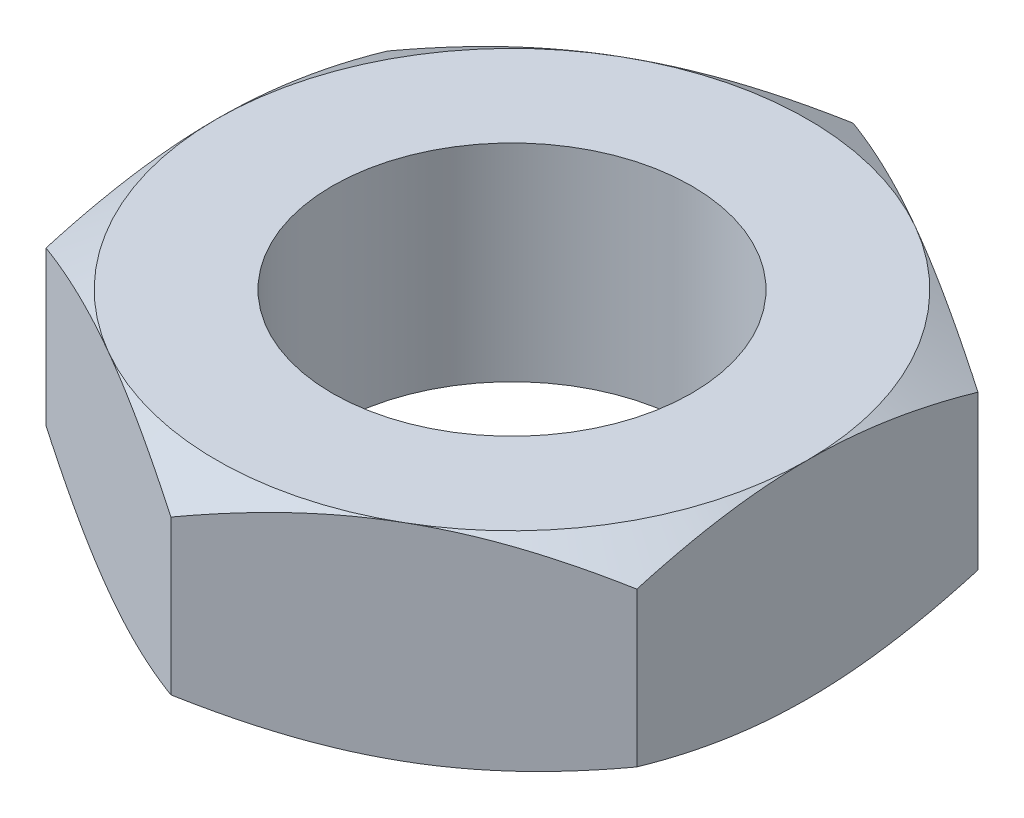
ISO-10303-21;
HEADER;
FILE_DESCRIPTION(('STEP AP214'),'2;1');
FILE_NAME('part.step','',(''),(''),'','','');
FILE_SCHEMA(('AUTOMOTIVE_DESIGN { 1 0 10303 214 1 1 1 1 }'));
ENDSEC;
DATA;
#1=APPLICATION_CONTEXT('core data for automotive mechanical design processes');
#2=APPLICATION_PROTOCOL_DEFINITION('international standard','automotive_design',2000,#1);
#3=PRODUCT_CONTEXT('',#1,'mechanical');
#4=PRODUCT('Part','Part','',(#3));
#5=PRODUCT_RELATED_PRODUCT_CATEGORY('part','',(#4));
#6=PRODUCT_DEFINITION_FORMATION('','',#4);
#7=PRODUCT_DEFINITION_CONTEXT('part definition',#1,'design');
#8=PRODUCT_DEFINITION('design','',#6,#7);
#9=PRODUCT_DEFINITION_SHAPE('','',#8);
#10=(LENGTH_UNIT() NAMED_UNIT(*) SI_UNIT(.MILLI.,.METRE.));
#11=(NAMED_UNIT(*) PLANE_ANGLE_UNIT() SI_UNIT($,.RADIAN.));
#12=(NAMED_UNIT(*) SI_UNIT($,.STERADIAN.) SOLID_ANGLE_UNIT());
#13=UNCERTAINTY_MEASURE_WITH_UNIT(LENGTH_MEASURE(1.E-05),#10,'distance_accuracy_value','');
#14=(GEOMETRIC_REPRESENTATION_CONTEXT(3) GLOBAL_UNCERTAINTY_ASSIGNED_CONTEXT((#13)) GLOBAL_UNIT_ASSIGNED_CONTEXT((#10,
#11,#12)) REPRESENTATION_CONTEXT('',''));
#15=CARTESIAN_POINT('',(0.,0.,0.));
#16=DIRECTION('',(0.,0.,1.));
#17=DIRECTION('',(1.,0.,0.));
#18=AXIS2_PLACEMENT_3D('',#15,#16,#17);
#19=CARTESIAN_POINT('',(-3.96875,1.3890625,-2.29135888084633));
#20=DIRECTION('',(0.,1.,0.));
#21=DIRECTION('',(0.,0.,1.));
#22=AXIS2_PLACEMENT_3D('',#19,#20,#21);
#23=PLANE('',#22);
#24=CARTESIAN_POINT('',(0.,1.3890625,0.));
#25=DIRECTION('',(0.,1.,0.));
#26=DIRECTION('',(0.,0.,1.));
#27=AXIS2_PLACEMENT_3D('',#24,#25,#26);
#28=CIRCLE('',#27,2.413);
#29=CARTESIAN_POINT('',(0.,1.3890625,2.413));
#30=VERTEX_POINT('',#29);
#31=EDGE_CURVE('E239',#30,#30,#28,.T.);
#32=ORIENTED_EDGE('',*,*,#31,.F.);
#33=EDGE_LOOP('',(#32));
#34=FACE_BOUND('',#33,.T.);
#35=CARTESIAN_POINT('',(0.,1.3890625,0.));
#36=DIRECTION('',(0.,1.,0.));
#37=DIRECTION('',(0.,0.,1.));
#38=AXIS2_PLACEMENT_3D('',#35,#36,#37);
#39=CIRCLE('',#38,3.96875);
#40=CARTESIAN_POINT('',(-1.984375,1.3890625,3.43703832126949));
#41=VERTEX_POINT('',#40);
#42=CARTESIAN_POINT('',(1.984375,1.3890625,3.43703832126949));
#43=VERTEX_POINT('',#42);
#44=EDGE_CURVE('E298',#41,#43,#39,.T.);
#45=ORIENTED_EDGE('',*,*,#44,.T.);
#46=CARTESIAN_POINT('',(3.96875,1.3890625,0.));
#47=VERTEX_POINT('',#46);
#48=EDGE_CURVE('E301',#43,#47,#39,.T.);
#49=ORIENTED_EDGE('',*,*,#48,.T.);
#50=CARTESIAN_POINT('',(1.984375,1.3890625,-3.43703832126949));
#51=VERTEX_POINT('',#50);
#52=EDGE_CURVE('E308',#47,#51,#39,.T.);
#53=ORIENTED_EDGE('',*,*,#52,.T.);
#54=CARTESIAN_POINT('',(-1.984375,1.3890625,-3.43703832126949));
#55=VERTEX_POINT('',#54);
#56=EDGE_CURVE('E312',#51,#55,#39,.T.);
#57=ORIENTED_EDGE('',*,*,#56,.T.);
#58=CARTESIAN_POINT('',(-3.96875,1.3890625,0.));
#59=VERTEX_POINT('',#58);
#60=EDGE_CURVE('E305',#55,#59,#39,.T.);
#61=ORIENTED_EDGE('',*,*,#60,.T.);
#62=EDGE_CURVE('E300',#59,#41,#39,.T.);
#63=ORIENTED_EDGE('',*,*,#62,.T.);
#64=EDGE_LOOP('',(#45,#49,#53,#57,#61,#63));
#65=FACE_BOUND('',#64,.T.);
#66=ADVANCED_FACE('F35',(#34,#65),#23,.T.);
#67=CARTESIAN_POINT('',(0.,1.3890625,-4.58271776169265));
#68=DIRECTION('',(0.5,0.,0.866025403784438));
#69=DIRECTION('',(0.866025403784439,0.,-0.5));
#70=AXIS2_PLACEMENT_3D('',#67,#68,#69);
#71=PLANE('',#70);
#72=DIRECTION('',(0.,-1.,0.));
#73=VECTOR('',#72,1.);
#74=CARTESIAN_POINT('',(0.,1.3890625,-4.58271776169265));
#75=LINE('',#74,#73);
#76=CARTESIAN_POINT('',(0.,1.034588047513,-4.58271776169265));
#77=VERTEX_POINT('',#76);
#78=CARTESIAN_POINT('',(0.,-1.034588047513,-4.58271776169265));
#79=VERTEX_POINT('',#78);
#80=EDGE_CURVE('E236',#77,#79,#75,.T.);
#81=ORIENTED_EDGE('',*,*,#80,.T.);
#82=CARTESIAN_POINT('',(0.00019999999999965,-1.03452137832671,-4.58283323174649));
#83=CARTESIAN_POINT('',(-0.174205902081157,-1.09267788164553,-4.48213993723168));
#84=CARTESIAN_POINT('',(-0.350117265982851,-1.14556901401833,-4.38057746392952));
#85=CARTESIAN_POINT('',(-0.704986056512738,-1.23789081645719,-4.17569387219009));
#86=CARTESIAN_POINT('',(-0.883949788458082,-1.27728882681341,-4.07236911337627));
#87=CARTESIAN_POINT('',(-1.23965934318176,-1.3386172964786,-3.86700010620323));
#88=CARTESIAN_POINT('',(-1.41635043707328,-1.36095593380879,-3.76498745558155));
#89=CARTESIAN_POINT('',(-1.7705639777928,-1.38762315750667,-3.56048217249653));
#90=CARTESIAN_POINT('',(-1.94808513722975,-1.39197382713073,-3.45799028330875));
#91=CARTESIAN_POINT('',(-2.27979074080338,-1.38292085025305,-3.26647996379381));
#92=CARTESIAN_POINT('',(-2.43402485076552,-1.37174001600782,-3.17743285888894));
#93=CARTESIAN_POINT('',(-2.74148824092522,-1.33630397944562,-2.99991878781428));
#94=CARTESIAN_POINT('',(-2.89471645773984,-1.31203667319011,-2.91145243558892));
#95=CARTESIAN_POINT('',(-3.20281373181353,-1.25137053864588,-2.73357239146588));
#96=CARTESIAN_POINT('',(-3.3576437962636,-1.21471455942136,-2.64418121207699));
#97=CARTESIAN_POINT('',(-3.66499472649982,-1.13151999862476,-2.46673206976942));
#98=CARTESIAN_POINT('',(-3.81751952962953,-1.08500096376704,-2.37867183362439));
#99=CARTESIAN_POINT('',(-3.96895,-1.03452137832671,-2.29124341079249));
#100=B_SPLINE_CURVE_WITH_KNOTS('',3,(#82,#83,#84,#85,#86,#87,#88,#89,#90,#91,#92,#93,#94,#95,
#96,#97,#98,#99),.UNSPECIFIED.,.F.,.F.,(4,2,2,2,2,2,2,2,4),(0.,0.629094460519773,
1.25970103886327,1.87470051579827,2.48894475282133,3.02377031984306,3.55909140824994,
4.1062865060967,4.65240713705191),.UNSPECIFIED.);
#101=CARTESIAN_POINT('',(-1.984375,-1.3890625,-3.43703832126949));
#102=VERTEX_POINT('',#101);
#103=EDGE_CURVE('E58',#79,#102,#100,.T.);
#104=ORIENTED_EDGE('',*,*,#103,.T.);
#105=CARTESIAN_POINT('',(-3.96875,-1.03458804751317,-2.2913588808466));
#106=VERTEX_POINT('',#105);
#107=EDGE_CURVE('E194',#102,#106,#100,.T.);
#108=ORIENTED_EDGE('',*,*,#107,.T.);
#109=DIRECTION('',(0.,-1.,0.));
#110=VECTOR('',#109,1.);
#111=CARTESIAN_POINT('',(-3.96875,1.3890625,-2.29135888084633));
#112=LINE('',#111,#110);
#113=CARTESIAN_POINT('',(-3.96875,1.03458804751317,-2.2913588808466));
#114=VERTEX_POINT('',#113);
#115=EDGE_CURVE('E224',#114,#106,#112,.T.);
#116=ORIENTED_EDGE('',*,*,#115,.F.);
#117=CARTESIAN_POINT('',(0.00019999999999965,1.03452137832671,-4.58283323174649));
#118=CARTESIAN_POINT('',(-0.174205902081157,1.09267788164553,-4.48213993723168));
#119=CARTESIAN_POINT('',(-0.350117265982851,1.14556901401833,-4.38057746392952));
#120=CARTESIAN_POINT('',(-0.704986056512738,1.23789081645719,-4.17569387219009));
#121=CARTESIAN_POINT('',(-0.883949788458082,1.27728882681341,-4.07236911337627));
#122=CARTESIAN_POINT('',(-1.23965934318176,1.3386172964786,-3.86700010620323));
#123=CARTESIAN_POINT('',(-1.41635043707328,1.36095593380879,-3.76498745558155));
#124=CARTESIAN_POINT('',(-1.7705639777928,1.38762315750667,-3.56048217249653));
#125=CARTESIAN_POINT('',(-1.94808513722975,1.39197382713073,-3.45799028330875));
#126=CARTESIAN_POINT('',(-2.27979074080338,1.38292085025305,-3.26647996379381));
#127=CARTESIAN_POINT('',(-2.43402485076552,1.37174001600782,-3.17743285888894));
#128=CARTESIAN_POINT('',(-2.74148824092522,1.33630397944562,-2.99991878781428));
#129=CARTESIAN_POINT('',(-2.89471645773984,1.31203667319011,-2.91145243558892));
#130=CARTESIAN_POINT('',(-3.20281373181353,1.25137053864588,-2.73357239146588));
#131=CARTESIAN_POINT('',(-3.3576437962636,1.21471455942136,-2.64418121207699));
#132=CARTESIAN_POINT('',(-3.66499472649982,1.13151999862476,-2.46673206976942));
#133=CARTESIAN_POINT('',(-3.81751952962953,1.08500096376704,-2.37867183362439));
#134=CARTESIAN_POINT('',(-3.96895,1.03452137832671,-2.29124341079249));
#135=B_SPLINE_CURVE_WITH_KNOTS('',3,(#117,#118,#119,#120,#121,#122,#123,#124,#125,#126,#127,
#128,#129,#130,#131,#132,#133,#134),.UNSPECIFIED.,.F.,.F.,(4,2,2,2,2,2,2,2,4),(0.,
0.629094460519773,1.25970103886327,1.87470051579827,2.48894475282133,3.02377031984306,
3.55909140824994,4.1062865060967,4.65240713705191),.UNSPECIFIED.);
#136=EDGE_CURVE('E246',#55,#114,#135,.T.);
#137=ORIENTED_EDGE('',*,*,#136,.F.);
#138=EDGE_CURVE('E243',#77,#55,#135,.T.);
#139=ORIENTED_EDGE('',*,*,#138,.F.);
#140=EDGE_LOOP('',(#81,#104,#108,#116,#137,#139));
#141=FACE_BOUND('',#140,.T.);
#142=ADVANCED_FACE('F37',(#141),#71,.F.);
#143=CARTESIAN_POINT('',(-3.96875,1.3890625,-2.29135888084633));
#144=DIRECTION('',(1.,0.,0.));
#145=DIRECTION('',(0.,0.,-1.));
#146=AXIS2_PLACEMENT_3D('',#143,#144,#145);
#147=PLANE('',#146);
#148=ORIENTED_EDGE('',*,*,#115,.T.);
#149=CARTESIAN_POINT('',(-3.96875,0.580270643707875,-6.22169695676345));
#150=CARTESIAN_POINT('',(-3.96875,0.495629554498546,-6.04776097042012));
#151=CARTESIAN_POINT('',(-3.96875,0.411781015228385,-5.87343276197247));
#152=CARTESIAN_POINT('',(-3.96875,0.246113557528974,-5.52378352626055));
#153=CARTESIAN_POINT('',(-3.96875,0.164294946503743,-5.34846235350417));
#154=CARTESIAN_POINT('',(-3.96875,0.00273455510915178,-4.99574743703183));
#155=CARTESIAN_POINT('',(-3.96875,-0.0769940637955183,-4.8183476443733));
#156=CARTESIAN_POINT('',(-3.96875,-0.233275940637596,-4.46216001234746));
#157=CARTESIAN_POINT('',(-3.96875,-0.3098293443539,-4.28337223715292));
#158=CARTESIAN_POINT('',(-3.96875,-0.461404283867797,-3.91814940793921));
#159=CARTESIAN_POINT('',(-3.96875,-0.536290207564717,-3.7316577704564));
#160=CARTESIAN_POINT('',(-3.96875,-0.680554504087907,-3.35651758495646));
#161=CARTESIAN_POINT('',(-3.96875,-0.74993226847017,-3.16786880128179));
#162=CARTESIAN_POINT('',(-3.96875,-0.881408126224332,-2.78844599514931));
#163=CARTESIAN_POINT('',(-3.96875,-0.943520384294776,-2.59767692965097));
#164=CARTESIAN_POINT('',(-3.96875,-1.05851662121305,-2.21340311120669));
#165=CARTESIAN_POINT('',(-3.96875,-1.11140343580595,-2.01989921874075));
#166=CARTESIAN_POINT('',(-3.96875,-1.20517636129246,-1.6311091012753));
#167=CARTESIAN_POINT('',(-3.96875,-1.24612852574059,-1.43583910195992));
#168=CARTESIAN_POINT('',(-3.96875,-1.31375702721554,-1.0428024899618));
#169=CARTESIAN_POINT('',(-3.96875,-1.34043487467902,-0.845036143697719));
#170=CARTESIAN_POINT('',(-3.96875,-1.3770403841221,-0.450605512338849));
#171=CARTESIAN_POINT('',(-3.96875,-1.38718865783126,-0.25396221985486));
#172=CARTESIAN_POINT('',(-3.96875,-1.39045976447106,0.139485992218314));
#173=CARTESIAN_POINT('',(-3.96875,-1.38358228756796,0.33629091468368));
#174=CARTESIAN_POINT('',(-3.96875,-1.35810261812635,0.668410754752708));
#175=CARTESIAN_POINT('',(-3.96875,-1.3437432404343,0.804072537555573));
#176=CARTESIAN_POINT('',(-3.96875,-1.30779247207964,1.0744408102038));
#177=CARTESIAN_POINT('',(-3.96875,-1.28620015652866,1.20914717562759));
#178=CARTESIAN_POINT('',(-3.96875,-1.21170483065242,1.61162887315064));
#179=CARTESIAN_POINT('',(-3.96875,-1.14909538893366,1.87762972847311));
#180=CARTESIAN_POINT('',(-3.96875,-1.04002741153514,2.27555191163833));
#181=CARTESIAN_POINT('',(-3.96875,-1.00061037701119,2.40952100703487));
#182=CARTESIAN_POINT('',(-3.96875,-0.917560151569727,2.67615857994853));
#183=CARTESIAN_POINT('',(-3.96875,-0.873926928994569,2.80882704769153));
#184=CARTESIAN_POINT('',(-3.96875,-0.783154734396829,3.07290448457615));
#185=CARTESIAN_POINT('',(-3.96875,-0.736016795290462,3.20431381202589));
#186=CARTESIAN_POINT('',(-3.96875,-0.638802011642294,3.46603416335526));
#187=CARTESIAN_POINT('',(-3.96875,-0.588725228974448,3.59634521029189));
#188=CARTESIAN_POINT('',(-3.96875,-0.452575047627681,3.94088412858893));
#189=CARTESIAN_POINT('',(-3.96875,-0.364374104411039,4.15427038484706));
#190=CARTESIAN_POINT('',(-3.96875,-0.18294698514972,4.57890352123334));
#191=CARTESIAN_POINT('',(-3.96875,-0.0897202959000224,4.79015018024977));
#192=CARTESIAN_POINT('',(-3.96875,0.100589836396977,5.21097578363183));
#193=CARTESIAN_POINT('',(-3.96875,0.197674518443244,5.42055416586364));
#194=CARTESIAN_POINT('',(-3.96875,0.394806200491001,5.83831597781125));
#195=CARTESIAN_POINT('',(-3.96875,0.494853286808513,6.04649936666374));
#196=CARTESIAN_POINT('',(-3.96875,0.697421654018019,6.46204015936939));
#197=CARTESIAN_POINT('',(-3.96875,0.799946395513732,6.66939587286292));
#198=CARTESIAN_POINT('',(-3.96875,1.00685664462163,7.08317779146199));
#199=CARTESIAN_POINT('',(-3.96875,1.11124217149255,7.2896039869195));
#200=CARTESIAN_POINT('',(-3.96875,1.42658702639339,7.90765670661576));
#201=CARTESIAN_POINT('',(-3.96875,1.63977745980658,8.31814439261519));
#202=CARTESIAN_POINT('',(-3.96875,2.04807122962612,9.09498840679135));
#203=CARTESIAN_POINT('',(-3.96875,2.24278532373391,9.46155029736983));
#204=CARTESIAN_POINT('',(-3.96875,2.63459143839332,10.1934273187956));
#205=CARTESIAN_POINT('',(-3.96875,2.83168359443524,10.5587423770687));
#206=CARTESIAN_POINT('',(-3.96875,3.22699755433617,11.2872403110954));
#207=CARTESIAN_POINT('',(-3.96875,3.42521369250251,11.6504262661362));
#208=CARTESIAN_POINT('',(-3.96875,3.82300419769018,12.3760186060547));
#209=CARTESIAN_POINT('',(-3.96875,4.02257846210827,12.7384250471593));
#210=CARTESIAN_POINT('',(-3.96875,4.22264849263489,13.1005558551109));
#211=B_SPLINE_CURVE_WITH_KNOTS('',3,(#149,#150,#151,#152,#153,#154,#155,#156,#157,#158,#159,
#160,#161,#162,#163,#164,#165,#166,#167,#168,#169,#170,#171,#172,#173,#174,#175,#176,#177,#178,
#179,#180,#181,#182,#183,#184,#185,#186,#187,#188,#189,#190,#191,#192,#193,#194,#195,#196,#197,
#198,#199,#200,#201,#202,#203,#204,#205,#206,#207,#208,#209,#210),.UNSPECIFIED.,.F.,.F.,(4,2,2,
2,2,2,2,2,2,2,2,2,2,2,2,2,2,2,2,2,2,2,2,2,2,2,2,2,2,2,4),(0.,0.580317532576746,1.16072241618541,
1.74417501419442,2.32760079530033,2.93042926439164,3.53332423092783,4.13502349111168,
4.73653747196744,5.33465617674795,5.93271157908309,6.52271762195251,7.11273440180051,
7.52179616412226,7.93091025386496,8.74954934292227,9.16845446095107,9.58736272461321,
10.0061480125919,10.4249244866913,11.1175183219819,11.8101830160883,12.5030719870989,
13.1959811668256,13.8899215612347,14.5838691419566,15.9714733438239,17.2166675132063,
18.4619329658364,19.7031966118937,20.9443675020377),.UNSPECIFIED.);
#212=CARTESIAN_POINT('',(-3.96875,-1.3890625,0.));
#213=VERTEX_POINT('',#212);
#214=EDGE_CURVE('E279',#106,#213,#211,.T.);
#215=ORIENTED_EDGE('',*,*,#214,.T.);
#216=CARTESIAN_POINT('',(-3.96875,-1.034588047513,2.29135888084633));
#217=VERTEX_POINT('',#216);
#218=EDGE_CURVE('E273',#213,#217,#211,.T.);
#219=ORIENTED_EDGE('',*,*,#218,.T.);
#220=DIRECTION('',(0.,-1.,0.));
#221=VECTOR('',#220,1.);
#222=CARTESIAN_POINT('',(-3.96875,1.3890625,2.29135888084633));
#223=LINE('',#222,#221);
#224=CARTESIAN_POINT('',(-3.96875,1.034588047513,2.29135888084633));
#225=VERTEX_POINT('',#224);
#226=EDGE_CURVE('E227',#225,#217,#223,.T.);
#227=ORIENTED_EDGE('',*,*,#226,.F.);
#228=CARTESIAN_POINT('',(-3.96875,-0.580270643707875,-6.22169695676345));
#229=CARTESIAN_POINT('',(-3.96875,-0.495629554498546,-6.04776097042012));
#230=CARTESIAN_POINT('',(-3.96875,-0.411781015228385,-5.87343276197247));
#231=CARTESIAN_POINT('',(-3.96875,-0.246113557528974,-5.52378352626055));
#232=CARTESIAN_POINT('',(-3.96875,-0.164294946503743,-5.34846235350417));
#233=CARTESIAN_POINT('',(-3.96875,-0.00273455510915178,-4.99574743703183));
#234=CARTESIAN_POINT('',(-3.96875,0.0769940637955183,-4.8183476443733));
#235=CARTESIAN_POINT('',(-3.96875,0.233275940637596,-4.46216001234746));
#236=CARTESIAN_POINT('',(-3.96875,0.3098293443539,-4.28337223715292));
#237=CARTESIAN_POINT('',(-3.96875,0.461404283867797,-3.91814940793921));
#238=CARTESIAN_POINT('',(-3.96875,0.536290207564717,-3.7316577704564));
#239=CARTESIAN_POINT('',(-3.96875,0.680554504087907,-3.35651758495646));
#240=CARTESIAN_POINT('',(-3.96875,0.74993226847017,-3.16786880128179));
#241=CARTESIAN_POINT('',(-3.96875,0.881408126224332,-2.78844599514931));
#242=CARTESIAN_POINT('',(-3.96875,0.943520384294776,-2.59767692965097));
#243=CARTESIAN_POINT('',(-3.96875,1.05851662121305,-2.21340311120669));
#244=CARTESIAN_POINT('',(-3.96875,1.11140343580595,-2.01989921874075));
#245=CARTESIAN_POINT('',(-3.96875,1.20517636129246,-1.6311091012753));
#246=CARTESIAN_POINT('',(-3.96875,1.24612852574059,-1.43583910195992));
#247=CARTESIAN_POINT('',(-3.96875,1.31375702721554,-1.0428024899618));
#248=CARTESIAN_POINT('',(-3.96875,1.34043487467902,-0.845036143697719));
#249=CARTESIAN_POINT('',(-3.96875,1.3770403841221,-0.450605512338849));
#250=CARTESIAN_POINT('',(-3.96875,1.38718865783126,-0.25396221985486));
#251=CARTESIAN_POINT('',(-3.96875,1.39045976447106,0.139485992218314));
#252=CARTESIAN_POINT('',(-3.96875,1.38358228756796,0.33629091468368));
#253=CARTESIAN_POINT('',(-3.96875,1.35810261812635,0.668410754752708));
#254=CARTESIAN_POINT('',(-3.96875,1.3437432404343,0.804072537555573));
#255=CARTESIAN_POINT('',(-3.96875,1.30779247207964,1.0744408102038));
#256=CARTESIAN_POINT('',(-3.96875,1.28620015652866,1.20914717562759));
#257=CARTESIAN_POINT('',(-3.96875,1.21170483065242,1.61162887315064));
#258=CARTESIAN_POINT('',(-3.96875,1.14909538893366,1.87762972847311));
#259=CARTESIAN_POINT('',(-3.96875,1.04002741153514,2.27555191163833));
#260=CARTESIAN_POINT('',(-3.96875,1.00061037701119,2.40952100703487));
#261=CARTESIAN_POINT('',(-3.96875,0.917560151569727,2.67615857994853));
#262=CARTESIAN_POINT('',(-3.96875,0.873926928994569,2.80882704769153));
#263=CARTESIAN_POINT('',(-3.96875,0.783154734396829,3.07290448457615));
#264=CARTESIAN_POINT('',(-3.96875,0.736016795290462,3.20431381202589));
#265=CARTESIAN_POINT('',(-3.96875,0.638802011642294,3.46603416335526));
#266=CARTESIAN_POINT('',(-3.96875,0.588725228974448,3.59634521029189));
#267=CARTESIAN_POINT('',(-3.96875,0.452575047627681,3.94088412858893));
#268=CARTESIAN_POINT('',(-3.96875,0.364374104411039,4.15427038484706));
#269=CARTESIAN_POINT('',(-3.96875,0.18294698514972,4.57890352123334));
#270=CARTESIAN_POINT('',(-3.96875,0.0897202959000224,4.79015018024977));
#271=CARTESIAN_POINT('',(-3.96875,-0.100589836396977,5.21097578363183));
#272=CARTESIAN_POINT('',(-3.96875,-0.197674518443244,5.42055416586364));
#273=CARTESIAN_POINT('',(-3.96875,-0.394806200491001,5.83831597781125));
#274=CARTESIAN_POINT('',(-3.96875,-0.494853286808513,6.04649936666374));
#275=CARTESIAN_POINT('',(-3.96875,-0.697421654018019,6.46204015936939));
#276=CARTESIAN_POINT('',(-3.96875,-0.799946395513732,6.66939587286292));
#277=CARTESIAN_POINT('',(-3.96875,-1.00685664462163,7.08317779146199));
#278=CARTESIAN_POINT('',(-3.96875,-1.11124217149255,7.2896039869195));
#279=CARTESIAN_POINT('',(-3.96875,-1.42658702639339,7.90765670661576));
#280=CARTESIAN_POINT('',(-3.96875,-1.63977745980658,8.31814439261519));
#281=CARTESIAN_POINT('',(-3.96875,-2.04807122962612,9.09498840679135));
#282=CARTESIAN_POINT('',(-3.96875,-2.24278532373391,9.46155029736983));
#283=CARTESIAN_POINT('',(-3.96875,-2.63459143839332,10.1934273187956));
#284=CARTESIAN_POINT('',(-3.96875,-2.83168359443524,10.5587423770687));
#285=CARTESIAN_POINT('',(-3.96875,-3.22699755433617,11.2872403110954));
#286=CARTESIAN_POINT('',(-3.96875,-3.42521369250251,11.6504262661362));
#287=CARTESIAN_POINT('',(-3.96875,-3.82300419769018,12.3760186060547));
#288=CARTESIAN_POINT('',(-3.96875,-4.02257846210827,12.7384250471593));
#289=CARTESIAN_POINT('',(-3.96875,-4.22264849263489,13.1005558551109));
#290=B_SPLINE_CURVE_WITH_KNOTS('',3,(#228,#229,#230,#231,#232,#233,#234,#235,#236,#237,#238,
#239,#240,#241,#242,#243,#244,#245,#246,#247,#248,#249,#250,#251,#252,#253,#254,#255,#256,#257,
#258,#259,#260,#261,#262,#263,#264,#265,#266,#267,#268,#269,#270,#271,#272,#273,#274,#275,#276,
#277,#278,#279,#280,#281,#282,#283,#284,#285,#286,#287,#288,#289),.UNSPECIFIED.,.F.,.F.,(4,2,2,
2,2,2,2,2,2,2,2,2,2,2,2,2,2,2,2,2,2,2,2,2,2,2,2,2,2,2,4),(0.,0.580317532576746,1.16072241618541,
1.74417501419442,2.32760079530033,2.93042926439164,3.53332423092783,4.13502349111168,
4.73653747196744,5.33465617674795,5.93271157908309,6.52271762195251,7.11273440180051,
7.52179616412226,7.93091025386496,8.74954934292227,9.16845446095107,9.58736272461321,
10.0061480125919,10.4249244866913,11.1175183219819,11.8101830160883,12.5030719870989,
13.1959811668256,13.8899215612347,14.5838691419566,15.9714733438239,17.2166675132063,
18.4619329658364,19.7031966118937,20.9443675020377),.UNSPECIFIED.);
#291=EDGE_CURVE('E253',#59,#225,#290,.T.);
#292=ORIENTED_EDGE('',*,*,#291,.F.);
#293=EDGE_CURVE('E252',#114,#59,#290,.T.);
#294=ORIENTED_EDGE('',*,*,#293,.F.);
#295=EDGE_LOOP('',(#148,#215,#219,#227,#292,#294));
#296=FACE_BOUND('',#295,.T.);
#297=ADVANCED_FACE('F266',(#296),#147,.F.);
#298=CARTESIAN_POINT('',(-3.96875,1.3890625,2.29135888084633));
#299=DIRECTION('',(0.5,0.,-0.866025403784438));
#300=DIRECTION('',(-0.866025403784439,0.,-0.5));
#301=AXIS2_PLACEMENT_3D('',#298,#299,#300);
#302=PLANE('',#301);
#303=ORIENTED_EDGE('',*,*,#226,.T.);
#304=CARTESIAN_POINT('',(-3.96895,-1.03452137832671,2.29124341079249));
#305=CARTESIAN_POINT('',(-3.79454409791884,-1.09267788164553,2.3919367053073));
#306=CARTESIAN_POINT('',(-3.61863273401715,-1.14556901401833,2.49349917860946));
#307=CARTESIAN_POINT('',(-3.26376394348726,-1.23789081645719,2.69838277034889));
#308=CARTESIAN_POINT('',(-3.08480021154192,-1.27728882681341,2.80170752916271));
#309=CARTESIAN_POINT('',(-2.72909065681824,-1.3386172964786,3.00707653633575));
#310=CARTESIAN_POINT('',(-2.55239956292672,-1.36095593380879,3.10908918695743));
#311=CARTESIAN_POINT('',(-2.1981860222072,-1.38762315750667,3.31359447004245));
#312=CARTESIAN_POINT('',(-2.02066486277025,-1.39197382713073,3.41608635923023));
#313=CARTESIAN_POINT('',(-1.68895925919662,-1.38292085025305,3.60759667874517));
#314=CARTESIAN_POINT('',(-1.53472514923448,-1.37174001600782,3.69664378365004));
#315=CARTESIAN_POINT('',(-1.22726175907477,-1.33630397944562,3.8741578547247));
#316=CARTESIAN_POINT('',(-1.07403354226016,-1.31203667319011,3.96262420695006));
#317=CARTESIAN_POINT('',(-0.765936268186465,-1.25137053864588,4.1405042510731));
#318=CARTESIAN_POINT('',(-0.611106203736397,-1.21471455942136,4.229895430462));
#319=CARTESIAN_POINT('',(-0.303755273500179,-1.13151999862476,4.40734457276956));
#320=CARTESIAN_POINT('',(-0.151230470370471,-1.08500096376703,4.49540480891459));
#321=CARTESIAN_POINT('',(0.000200000000000126,-1.03452137832671,4.58283323174649));
#322=B_SPLINE_CURVE_WITH_KNOTS('',3,(#304,#305,#306,#307,#308,#309,#310,#311,#312,#313,#314,
#315,#316,#317,#318,#319,#320,#321),.UNSPECIFIED.,.F.,.F.,(4,2,2,2,2,2,2,2,4),(0.,
0.629094460519771,1.25970103886327,1.87470051579826,2.48894475282133,3.02377031984306,
3.55909140824994,4.1062865060967,4.65240713705191),.UNSPECIFIED.);
#323=CARTESIAN_POINT('',(-1.984375,-1.3890625,3.43703832126949));
#324=VERTEX_POINT('',#323);
#325=EDGE_CURVE('E159',#217,#324,#322,.T.);
#326=ORIENTED_EDGE('',*,*,#325,.T.);
#327=CARTESIAN_POINT('',(0.,-1.034588047513,4.58271776169265));
#328=VERTEX_POINT('',#327);
#329=EDGE_CURVE('E143',#324,#328,#322,.T.);
#330=ORIENTED_EDGE('',*,*,#329,.T.);
#331=DIRECTION('',(0.,-1.,0.));
#332=VECTOR('',#331,1.);
#333=CARTESIAN_POINT('',(0.,1.3890625,4.58271776169265));
#334=LINE('',#333,#332);
#335=CARTESIAN_POINT('',(0.,1.034588047513,4.58271776169265));
#336=VERTEX_POINT('',#335);
#337=EDGE_CURVE('E158',#336,#328,#334,.T.);
#338=ORIENTED_EDGE('',*,*,#337,.F.);
#339=CARTESIAN_POINT('',(-3.96895,1.03452137832671,2.29124341079249));
#340=CARTESIAN_POINT('',(-3.79454409791884,1.09267788164553,2.3919367053073));
#341=CARTESIAN_POINT('',(-3.61863273401715,1.14556901401833,2.49349917860946));
#342=CARTESIAN_POINT('',(-3.26376394348726,1.23789081645719,2.69838277034889));
#343=CARTESIAN_POINT('',(-3.08480021154192,1.27728882681341,2.80170752916271));
#344=CARTESIAN_POINT('',(-2.72909065681824,1.3386172964786,3.00707653633575));
#345=CARTESIAN_POINT('',(-2.55239956292672,1.36095593380879,3.10908918695743));
#346=CARTESIAN_POINT('',(-2.1981860222072,1.38762315750667,3.31359447004245));
#347=CARTESIAN_POINT('',(-2.02066486277025,1.39197382713073,3.41608635923023));
#348=CARTESIAN_POINT('',(-1.68895925919662,1.38292085025305,3.60759667874517));
#349=CARTESIAN_POINT('',(-1.53472514923448,1.37174001600782,3.69664378365004));
#350=CARTESIAN_POINT('',(-1.22726175907477,1.33630397944562,3.8741578547247));
#351=CARTESIAN_POINT('',(-1.07403354226016,1.31203667319011,3.96262420695006));
#352=CARTESIAN_POINT('',(-0.765936268186465,1.25137053864588,4.1405042510731));
#353=CARTESIAN_POINT('',(-0.611106203736397,1.21471455942136,4.229895430462));
#354=CARTESIAN_POINT('',(-0.303755273500179,1.13151999862476,4.40734457276956));
#355=CARTESIAN_POINT('',(-0.151230470370471,1.08500096376703,4.49540480891459));
#356=CARTESIAN_POINT('',(0.000200000000000126,1.03452137832671,4.58283323174649));
#357=B_SPLINE_CURVE_WITH_KNOTS('',3,(#339,#340,#341,#342,#343,#344,#345,#346,#347,#348,#349,
#350,#351,#352,#353,#354,#355,#356),.UNSPECIFIED.,.F.,.F.,(4,2,2,2,2,2,2,2,4),(0.,
0.629094460519771,1.25970103886327,1.87470051579826,2.48894475282133,3.02377031984306,
3.55909140824994,4.1062865060967,4.65240713705191),.UNSPECIFIED.);
#358=EDGE_CURVE('E260',#41,#336,#357,.T.);
#359=ORIENTED_EDGE('',*,*,#358,.F.);
#360=EDGE_CURVE('E259',#225,#41,#357,.T.);
#361=ORIENTED_EDGE('',*,*,#360,.F.);
#362=EDGE_LOOP('',(#303,#326,#330,#338,#359,#361));
#363=FACE_BOUND('',#362,.T.);
#364=ADVANCED_FACE('F269',(#363),#302,.F.);
#365=CARTESIAN_POINT('',(0.,1.3890625,4.58271776169265));
#366=DIRECTION('',(-0.5,0.,-0.866025403784438));
#367=DIRECTION('',(-0.866025403784439,0.,0.5));
#368=AXIS2_PLACEMENT_3D('',#365,#366,#367);
#369=PLANE('',#368);
#370=ORIENTED_EDGE('',*,*,#337,.T.);
#371=CARTESIAN_POINT('',(-0.000200000000000108,-1.03452137832671,4.58283323174649));
#372=CARTESIAN_POINT('',(0.174205902081156,-1.09267788164553,4.48213993723168));
#373=CARTESIAN_POINT('',(0.35011726598285,-1.14556901401833,4.38057746392952));
#374=CARTESIAN_POINT('',(0.704986056512737,-1.23789081645719,4.17569387219009));
#375=CARTESIAN_POINT('',(0.883949788458081,-1.27728882681341,4.07236911337627));
#376=CARTESIAN_POINT('',(1.23965934318176,-1.3386172964786,3.86700010620323));
#377=CARTESIAN_POINT('',(1.41635043707328,-1.36095593380879,3.76498745558155));
#378=CARTESIAN_POINT('',(1.7705639777928,-1.38762315750667,3.56048217249653));
#379=CARTESIAN_POINT('',(1.94808513722975,-1.39197382713073,3.45799028330875));
#380=CARTESIAN_POINT('',(2.27979074080338,-1.38292085025305,3.26647996379381));
#381=CARTESIAN_POINT('',(2.43402485076552,-1.37174001600782,3.17743285888894));
#382=CARTESIAN_POINT('',(2.74148824092522,-1.33630397944562,2.99991878781428));
#383=CARTESIAN_POINT('',(2.89471645773984,-1.31203667319011,2.91145243558892));
#384=CARTESIAN_POINT('',(3.20281373181353,-1.25137053864589,2.73357239146588));
#385=CARTESIAN_POINT('',(3.3576437962636,-1.21471455942136,2.64418121207699));
#386=CARTESIAN_POINT('',(3.66499472649982,-1.13151999862476,2.46673206976942));
#387=CARTESIAN_POINT('',(3.81751952962953,-1.08500096376704,2.37867183362439));
#388=CARTESIAN_POINT('',(3.96895,-1.03452137832671,2.29124341079249));
#389=B_SPLINE_CURVE_WITH_KNOTS('',3,(#371,#372,#373,#374,#375,#376,#377,#378,#379,#380,#381,
#382,#383,#384,#385,#386,#387,#388),.UNSPECIFIED.,.F.,.F.,(4,2,2,2,2,2,2,2,4),(0.,
0.629094460519772,1.25970103886327,1.87470051579826,2.48894475282133,3.02377031984306,
3.55909140824994,4.1062865060967,4.65240713705191),.UNSPECIFIED.);
#390=CARTESIAN_POINT('',(1.984375,-1.3890625,3.43703832126949));
#391=VERTEX_POINT('',#390);
#392=EDGE_CURVE('E137',#328,#391,#389,.T.);
#393=ORIENTED_EDGE('',*,*,#392,.T.);
#394=CARTESIAN_POINT('',(3.96875,-1.034588047513,2.29135888084633));
#395=VERTEX_POINT('',#394);
#396=EDGE_CURVE('E125',#391,#395,#389,.T.);
#397=ORIENTED_EDGE('',*,*,#396,.T.);
#398=DIRECTION('',(0.,-1.,0.));
#399=VECTOR('',#398,1.);
#400=CARTESIAN_POINT('',(3.96875,1.3890625,2.29135888084633));
#401=LINE('',#400,#399);
#402=CARTESIAN_POINT('',(3.96875,1.034588047513,2.29135888084633));
#403=VERTEX_POINT('',#402);
#404=EDGE_CURVE('E231',#403,#395,#401,.T.);
#405=ORIENTED_EDGE('',*,*,#404,.F.);
#406=CARTESIAN_POINT('',(-0.000200000000000108,1.03452137832671,4.58283323174649));
#407=CARTESIAN_POINT('',(0.174205902081156,1.09267788164553,4.48213993723168));
#408=CARTESIAN_POINT('',(0.35011726598285,1.14556901401833,4.38057746392952));
#409=CARTESIAN_POINT('',(0.704986056512737,1.23789081645719,4.17569387219009));
#410=CARTESIAN_POINT('',(0.883949788458081,1.27728882681341,4.07236911337627));
#411=CARTESIAN_POINT('',(1.23965934318176,1.3386172964786,3.86700010620323));
#412=CARTESIAN_POINT('',(1.41635043707328,1.36095593380879,3.76498745558155));
#413=CARTESIAN_POINT('',(1.7705639777928,1.38762315750667,3.56048217249653));
#414=CARTESIAN_POINT('',(1.94808513722975,1.39197382713073,3.45799028330875));
#415=CARTESIAN_POINT('',(2.27979074080338,1.38292085025305,3.26647996379381));
#416=CARTESIAN_POINT('',(2.43402485076552,1.37174001600782,3.17743285888894));
#417=CARTESIAN_POINT('',(2.74148824092522,1.33630397944562,2.99991878781428));
#418=CARTESIAN_POINT('',(2.89471645773984,1.31203667319011,2.91145243558892));
#419=CARTESIAN_POINT('',(3.20281373181353,1.25137053864589,2.73357239146588));
#420=CARTESIAN_POINT('',(3.3576437962636,1.21471455942136,2.64418121207699));
#421=CARTESIAN_POINT('',(3.66499472649982,1.13151999862476,2.46673206976942));
#422=CARTESIAN_POINT('',(3.81751952962953,1.08500096376704,2.37867183362439));
#423=CARTESIAN_POINT('',(3.96895,1.03452137832671,2.29124341079249));
#424=B_SPLINE_CURVE_WITH_KNOTS('',3,(#406,#407,#408,#409,#410,#411,#412,#413,#414,#415,#416,
#417,#418,#419,#420,#421,#422,#423),.UNSPECIFIED.,.F.,.F.,(4,2,2,2,2,2,2,2,4),(0.,
0.629094460519772,1.25970103886327,1.87470051579826,2.48894475282133,3.02377031984306,
3.55909140824994,4.1062865060967,4.65240713705191),.UNSPECIFIED.);
#425=EDGE_CURVE('E330',#43,#403,#424,.T.);
#426=ORIENTED_EDGE('',*,*,#425,.F.);
#427=EDGE_CURVE('E332',#336,#43,#424,.T.);
#428=ORIENTED_EDGE('',*,*,#427,.F.);
#429=EDGE_LOOP('',(#370,#393,#397,#405,#426,#428));
#430=FACE_BOUND('',#429,.T.);
#431=ADVANCED_FACE('F155',(#430),#369,.F.);
#432=CARTESIAN_POINT('',(3.96875,1.3890625,2.29135888084633));
#433=DIRECTION('',(-1.,0.,0.));
#434=DIRECTION('',(0.,0.,1.));
#435=AXIS2_PLACEMENT_3D('',#432,#433,#434);
#436=PLANE('',#435);
#437=ORIENTED_EDGE('',*,*,#404,.T.);
#438=CARTESIAN_POINT('',(3.96875,0.580270644592316,-6.22169695858048));
#439=CARTESIAN_POINT('',(3.96875,0.495629555346083,-6.047760972176));
#440=CARTESIAN_POINT('',(3.96875,0.411781016039039,-5.87343276366715));
#441=CARTESIAN_POINT('',(3.96875,0.246113558266038,-5.52378352783265));
#442=CARTESIAN_POINT('',(3.96875,0.164294947204102,-5.34846235501489));
#443=CARTESIAN_POINT('',(3.96875,0.00273455573607695,-4.99574743841885));
#444=CARTESIAN_POINT('',(3.96875,-0.0769940632053148,-4.81834764569799));
#445=CARTESIAN_POINT('',(3.96875,-0.233275940120227,-4.46216001354709));
#446=CARTESIAN_POINT('',(3.96875,-0.309829343872644,-4.2833722382898));
#447=CARTESIAN_POINT('',(3.96875,-0.461404283459805,-3.91814940894576));
#448=CARTESIAN_POINT('',(3.96875,-0.536290207193792,-3.73165777139531));
#449=CARTESIAN_POINT('',(3.96875,-0.680554503789142,-3.356517585759));
#450=CARTESIAN_POINT('',(3.96875,-0.749932268206498,-3.1678688020156));
#451=CARTESIAN_POINT('',(3.96875,-0.881408126027497,-2.7884459957444));
#452=CARTESIAN_POINT('',(3.96875,-0.943520384129694,-2.59767693017607));
#453=CARTESIAN_POINT('',(3.96875,-1.0585166211063,-2.2134031115899));
#454=CARTESIAN_POINT('',(3.96875,-1.1114034357258,-2.01989921905207));
#455=CARTESIAN_POINT('',(3.96875,-1.20517636126597,-1.63110910140599));
#456=CARTESIAN_POINT('',(3.96875,-1.24612852573913,-1.43583910198137));
#457=CARTESIAN_POINT('',(3.96875,-1.31375702724767,-1.04280248976214));
#458=CARTESIAN_POINT('',(3.96875,-1.34043487471972,-0.84503614338618));
#459=CARTESIAN_POINT('',(3.96875,-1.37704038415999,-0.450605511805401));
#460=CARTESIAN_POINT('',(3.96875,-1.38718865785815,-0.253962219211404));
#461=CARTESIAN_POINT('',(3.96875,-1.3904597644567,0.139485993080117));
#462=CARTESIAN_POINT('',(3.96875,-1.38358228752336,0.336290915653822));
#463=CARTESIAN_POINT('',(3.96875,-1.35810261802072,0.668410755858784));
#464=CARTESIAN_POINT('',(3.96875,-1.34374324030448,0.804072538690473));
#465=CARTESIAN_POINT('',(3.96875,-1.30779247190017,1.07444081139505));
#466=CARTESIAN_POINT('',(3.96875,-1.28620015632371,1.20914717684638));
#467=CARTESIAN_POINT('',(3.96875,-1.21170483037051,1.61162887445052));
#468=CARTESIAN_POINT('',(3.96875,-1.14909538859978,1.87762972982491));
#469=CARTESIAN_POINT('',(3.96875,-1.04002741112456,2.27555191306781));
#470=CARTESIAN_POINT('',(3.96875,-1.00061037657487,2.40952100849079));
#471=CARTESIAN_POINT('',(3.96875,-0.917560151082714,2.67615858145704));
#472=CARTESIAN_POINT('',(3.96875,-0.873926928482603,2.80882704922619));
#473=CARTESIAN_POINT('',(3.96875,-0.783154733835851,3.07290448616292));
#474=CARTESIAN_POINT('',(3.96875,-0.736016794705428,3.20431381363862));
#475=CARTESIAN_POINT('',(3.96875,-0.638802011009983,3.4660341650199));
#476=CARTESIAN_POINT('',(3.96875,-0.588725228318917,3.59634521198249));
#477=CARTESIAN_POINT('',(3.96875,-0.452575046932804,3.94088413029471));
#478=CARTESIAN_POINT('',(3.96875,-0.364374103702386,4.1542703865428));
#479=CARTESIAN_POINT('',(3.96875,-0.182946984417413,4.57890352291026));
#480=CARTESIAN_POINT('',(3.96875,-0.0897202951578391,4.79015018191792));
#481=CARTESIAN_POINT('',(3.96875,0.10058983715607,5.21097578528339));
#482=CARTESIAN_POINT('',(3.96875,0.197674519209366,5.42055416750738));
#483=CARTESIAN_POINT('',(3.96875,0.394806201269148,5.83831597944015));
#484=CARTESIAN_POINT('',(3.96875,0.494853287591656,6.04649936828564));
#485=CARTESIAN_POINT('',(3.96875,0.697421654809467,6.46204016097752));
#486=CARTESIAN_POINT('',(3.96875,0.799946396308484,6.66939587446428));
#487=CARTESIAN_POINT('',(3.96875,1.00685664542186,7.08317779305034));
#488=CARTESIAN_POINT('',(3.96875,1.11124217229495,7.28960398850158));
#489=CARTESIAN_POINT('',(3.96875,1.42658702720112,7.90765670817981));
#490=CARTESIAN_POINT('',(3.96875,1.6397774606162,8.31814439416806));
#491=CARTESIAN_POINT('',(3.96875,2.0480712304422,9.09498840833302));
#492=CARTESIAN_POINT('',(3.96875,2.24278532455485,9.46155029891136));
#493=CARTESIAN_POINT('',(3.96875,2.63459143922298,10.1934273203373));
#494=CARTESIAN_POINT('',(3.96875,2.83168359526876,10.5587423786107));
#495=CARTESIAN_POINT('',(3.96875,3.22699755517756,11.2872403126399));
#496=CARTESIAN_POINT('',(3.96875,3.42521369334793,11.6504262676829));
#497=CARTESIAN_POINT('',(3.96875,3.8230041985432,12.3760186076061));
#498=CARTESIAN_POINT('',(3.96875,4.02257846296487,12.7384250487132));
#499=CARTESIAN_POINT('',(3.96875,4.22264849349491,13.1005558566674));
#500=B_SPLINE_CURVE_WITH_KNOTS('',3,(#438,#439,#440,#441,#442,#443,#444,#445,#446,#447,#448,
#449,#450,#451,#452,#453,#454,#455,#456,#457,#458,#459,#460,#461,#462,#463,#464,#465,#466,#467,
#468,#469,#470,#471,#472,#473,#474,#475,#476,#477,#478,#479,#480,#481,#482,#483,#484,#485,#486,
#487,#488,#489,#490,#491,#492,#493,#494,#495,#496,#497,#498,#499),.UNSPECIFIED.,.F.,.F.,(4,2,2,
2,2,2,2,2,2,2,2,2,2,2,2,2,2,2,2,2,2,2,2,2,2,2,2,2,2,2,4),(0.,0.580317532790153,1.16072241661226,
1.74417501483696,2.32760079615855,2.93042926547958,3.53332423224556,4.13502349265846,
4.73653747374307,5.334656178859,5.93271158152908,6.52271762472512,7.1127344048999,
7.52179616731526,7.93091025715158,8.74954934639652,9.16845446452328,9.58736272828336,
10.0061480163598,10.4249244905568,11.1175183258355,11.8101830199298,12.503071990928,
13.1959811706424,13.8899215650377,14.5838691457458,15.971473347586,17.2166675169748,
18.4619329696112,19.7031966156801,20.9443675058358),.UNSPECIFIED.);
#501=CARTESIAN_POINT('',(3.96875,-1.3890625,0.));
#502=VERTEX_POINT('',#501);
#503=EDGE_CURVE('E132',#395,#502,#500,.F.);
#504=ORIENTED_EDGE('',*,*,#503,.T.);
#505=CARTESIAN_POINT('',(3.96875,-1.034588047513,-2.29135888084633));
#506=VERTEX_POINT('',#505);
#507=EDGE_CURVE('E168',#502,#506,#500,.F.);
#508=ORIENTED_EDGE('',*,*,#507,.T.);
#509=DIRECTION('',(0.,-1.,0.));
#510=VECTOR('',#509,1.);
#511=CARTESIAN_POINT('',(3.96875,1.3890625,-2.29135888084633));
#512=LINE('',#511,#510);
#513=CARTESIAN_POINT('',(3.96875,1.034588047513,-2.29135888084633));
#514=VERTEX_POINT('',#513);
#515=EDGE_CURVE('E233',#514,#506,#512,.T.);
#516=ORIENTED_EDGE('',*,*,#515,.F.);
#517=CARTESIAN_POINT('',(3.96875,-0.580270644592316,-6.22169695858048));
#518=CARTESIAN_POINT('',(3.96875,-0.495629555346083,-6.047760972176));
#519=CARTESIAN_POINT('',(3.96875,-0.411781016039039,-5.87343276366715));
#520=CARTESIAN_POINT('',(3.96875,-0.246113558266038,-5.52378352783265));
#521=CARTESIAN_POINT('',(3.96875,-0.164294947204102,-5.34846235501489));
#522=CARTESIAN_POINT('',(3.96875,-0.00273455573607695,-4.99574743841885));
#523=CARTESIAN_POINT('',(3.96875,0.0769940632053148,-4.81834764569799));
#524=CARTESIAN_POINT('',(3.96875,0.233275940120227,-4.46216001354709));
#525=CARTESIAN_POINT('',(3.96875,0.309829343872644,-4.2833722382898));
#526=CARTESIAN_POINT('',(3.96875,0.461404283459805,-3.91814940894576));
#527=CARTESIAN_POINT('',(3.96875,0.536290207193792,-3.73165777139531));
#528=CARTESIAN_POINT('',(3.96875,0.680554503789142,-3.356517585759));
#529=CARTESIAN_POINT('',(3.96875,0.749932268206498,-3.1678688020156));
#530=CARTESIAN_POINT('',(3.96875,0.881408126027497,-2.7884459957444));
#531=CARTESIAN_POINT('',(3.96875,0.943520384129694,-2.59767693017607));
#532=CARTESIAN_POINT('',(3.96875,1.0585166211063,-2.2134031115899));
#533=CARTESIAN_POINT('',(3.96875,1.1114034357258,-2.01989921905207));
#534=CARTESIAN_POINT('',(3.96875,1.20517636126597,-1.63110910140599));
#535=CARTESIAN_POINT('',(3.96875,1.24612852573913,-1.43583910198137));
#536=CARTESIAN_POINT('',(3.96875,1.31375702724767,-1.04280248976214));
#537=CARTESIAN_POINT('',(3.96875,1.34043487471972,-0.84503614338618));
#538=CARTESIAN_POINT('',(3.96875,1.37704038415999,-0.450605511805401));
#539=CARTESIAN_POINT('',(3.96875,1.38718865785815,-0.253962219211404));
#540=CARTESIAN_POINT('',(3.96875,1.3904597644567,0.139485993080117));
#541=CARTESIAN_POINT('',(3.96875,1.38358228752336,0.336290915653822));
#542=CARTESIAN_POINT('',(3.96875,1.35810261802072,0.668410755858784));
#543=CARTESIAN_POINT('',(3.96875,1.34374324030448,0.804072538690473));
#544=CARTESIAN_POINT('',(3.96875,1.30779247190017,1.07444081139505));
#545=CARTESIAN_POINT('',(3.96875,1.28620015632371,1.20914717684638));
#546=CARTESIAN_POINT('',(3.96875,1.21170483037051,1.61162887445052));
#547=CARTESIAN_POINT('',(3.96875,1.14909538859978,1.87762972982491));
#548=CARTESIAN_POINT('',(3.96875,1.04002741112456,2.27555191306781));
#549=CARTESIAN_POINT('',(3.96875,1.00061037657487,2.40952100849079));
#550=CARTESIAN_POINT('',(3.96875,0.917560151082714,2.67615858145704));
#551=CARTESIAN_POINT('',(3.96875,0.873926928482603,2.80882704922619));
#552=CARTESIAN_POINT('',(3.96875,0.783154733835851,3.07290448616292));
#553=CARTESIAN_POINT('',(3.96875,0.736016794705428,3.20431381363862));
#554=CARTESIAN_POINT('',(3.96875,0.638802011009983,3.4660341650199));
#555=CARTESIAN_POINT('',(3.96875,0.588725228318917,3.59634521198249));
#556=CARTESIAN_POINT('',(3.96875,0.452575046932804,3.94088413029471));
#557=CARTESIAN_POINT('',(3.96875,0.364374103702386,4.1542703865428));
#558=CARTESIAN_POINT('',(3.96875,0.182946984417413,4.57890352291026));
#559=CARTESIAN_POINT('',(3.96875,0.0897202951578391,4.79015018191792));
#560=CARTESIAN_POINT('',(3.96875,-0.10058983715607,5.21097578528339));
#561=CARTESIAN_POINT('',(3.96875,-0.197674519209366,5.42055416750738));
#562=CARTESIAN_POINT('',(3.96875,-0.394806201269148,5.83831597944015));
#563=CARTESIAN_POINT('',(3.96875,-0.494853287591656,6.04649936828564));
#564=CARTESIAN_POINT('',(3.96875,-0.697421654809467,6.46204016097752));
#565=CARTESIAN_POINT('',(3.96875,-0.799946396308484,6.66939587446428));
#566=CARTESIAN_POINT('',(3.96875,-1.00685664542186,7.08317779305034));
#567=CARTESIAN_POINT('',(3.96875,-1.11124217229495,7.28960398850158));
#568=CARTESIAN_POINT('',(3.96875,-1.42658702720112,7.90765670817981));
#569=CARTESIAN_POINT('',(3.96875,-1.6397774606162,8.31814439416806));
#570=CARTESIAN_POINT('',(3.96875,-2.0480712304422,9.09498840833302));
#571=CARTESIAN_POINT('',(3.96875,-2.24278532455485,9.46155029891136));
#572=CARTESIAN_POINT('',(3.96875,-2.63459143922298,10.1934273203373));
#573=CARTESIAN_POINT('',(3.96875,-2.83168359526876,10.5587423786107));
#574=CARTESIAN_POINT('',(3.96875,-3.22699755517756,11.2872403126399));
#575=CARTESIAN_POINT('',(3.96875,-3.42521369334793,11.6504262676829));
#576=CARTESIAN_POINT('',(3.96875,-3.8230041985432,12.3760186076061));
#577=CARTESIAN_POINT('',(3.96875,-4.02257846296487,12.7384250487132));
#578=CARTESIAN_POINT('',(3.96875,-4.22264849349491,13.1005558566674));
#579=B_SPLINE_CURVE_WITH_KNOTS('',3,(#517,#518,#519,#520,#521,#522,#523,#524,#525,#526,#527,
#528,#529,#530,#531,#532,#533,#534,#535,#536,#537,#538,#539,#540,#541,#542,#543,#544,#545,#546,
#547,#548,#549,#550,#551,#552,#553,#554,#555,#556,#557,#558,#559,#560,#561,#562,#563,#564,#565,
#566,#567,#568,#569,#570,#571,#572,#573,#574,#575,#576,#577,#578),.UNSPECIFIED.,.F.,.F.,(4,2,2,
2,2,2,2,2,2,2,2,2,2,2,2,2,2,2,2,2,2,2,2,2,2,2,2,2,2,2,4),(0.,0.580317532790153,1.16072241661226,
1.74417501483696,2.32760079615855,2.93042926547958,3.53332423224556,4.13502349265846,
4.73653747374307,5.334656178859,5.93271158152908,6.52271762472512,7.1127344048999,
7.52179616731526,7.93091025715158,8.74954934639652,9.16845446452328,9.58736272828336,
10.0061480163598,10.4249244905568,11.1175183258355,11.8101830199298,12.503071990928,
13.1959811706424,13.8899215650377,14.5838691457458,15.971473347586,17.2166675169748,
18.4619329696112,19.7031966156801,20.9443675058358),.UNSPECIFIED.);
#580=EDGE_CURVE('E307',#47,#514,#579,.F.);
#581=ORIENTED_EDGE('',*,*,#580,.F.);
#582=EDGE_CURVE('E311',#403,#47,#579,.F.);
#583=ORIENTED_EDGE('',*,*,#582,.F.);
#584=EDGE_LOOP('',(#437,#504,#508,#516,#581,#583));
#585=FACE_BOUND('',#584,.T.);
#586=ADVANCED_FACE('F213',(#585),#436,.F.);
#587=CARTESIAN_POINT('',(3.96875,1.3890625,-2.29135888084633));
#588=DIRECTION('',(-0.5,0.,0.866025403784439));
#589=DIRECTION('',(0.866025403784439,0.,0.5));
#590=AXIS2_PLACEMENT_3D('',#587,#588,#589);
#591=PLANE('',#590);
#592=ORIENTED_EDGE('',*,*,#515,.T.);
#593=CARTESIAN_POINT('',(3.96895,-1.03452137832671,-2.29124341079249));
#594=CARTESIAN_POINT('',(3.79454409791884,-1.09267788164553,-2.3919367053073));
#595=CARTESIAN_POINT('',(3.61863273401715,-1.14556901401833,-2.49349917860946));
#596=CARTESIAN_POINT('',(3.26376394348726,-1.23789081645719,-2.69838277034889));
#597=CARTESIAN_POINT('',(3.08480021154192,-1.27728882681341,-2.80170752916271));
#598=CARTESIAN_POINT('',(2.72909065681824,-1.3386172964786,-3.00707653633575));
#599=CARTESIAN_POINT('',(2.55239956292672,-1.36095593380879,-3.10908918695743));
#600=CARTESIAN_POINT('',(2.1981860222072,-1.38762315750667,-3.31359447004245));
#601=CARTESIAN_POINT('',(2.02066486277024,-1.39197382713073,-3.41608635923023));
#602=CARTESIAN_POINT('',(1.68895925919662,-1.38292085025305,-3.60759667874517));
#603=CARTESIAN_POINT('',(1.53472514923448,-1.37174001600782,-3.69664378365004));
#604=CARTESIAN_POINT('',(1.22726175907477,-1.33630397944562,-3.8741578547247));
#605=CARTESIAN_POINT('',(1.07403354226016,-1.31203667319011,-3.96262420695006));
#606=CARTESIAN_POINT('',(0.765936268186464,-1.25137053864588,-4.1405042510731));
#607=CARTESIAN_POINT('',(0.611106203736396,-1.21471455942136,-4.229895430462));
#608=CARTESIAN_POINT('',(0.303755273500177,-1.13151999862476,-4.40734457276956));
#609=CARTESIAN_POINT('',(0.15123047037047,-1.08500096376703,-4.49540480891459));
#610=CARTESIAN_POINT('',(-0.000200000000000769,-1.03452137832671,-4.58283323174649));
#611=B_SPLINE_CURVE_WITH_KNOTS('',3,(#593,#594,#595,#596,#597,#598,#599,#600,#601,#602,#603,
#604,#605,#606,#607,#608,#609,#610),.UNSPECIFIED.,.F.,.F.,(4,2,2,2,2,2,2,2,4),(0.,
0.629094460519772,1.25970103886327,1.87470051579827,2.48894475282133,3.02377031984306,
3.55909140824994,4.1062865060967,4.65240713705191),.UNSPECIFIED.);
#612=CARTESIAN_POINT('',(1.984375,-1.3890625,-3.43703832126949));
#613=VERTEX_POINT('',#612);
#614=EDGE_CURVE('E208',#506,#613,#611,.T.);
#615=ORIENTED_EDGE('',*,*,#614,.T.);
#616=EDGE_CURVE('E152',#613,#79,#611,.T.);
#617=ORIENTED_EDGE('',*,*,#616,.T.);
#618=ORIENTED_EDGE('',*,*,#80,.F.);
#619=CARTESIAN_POINT('',(3.96895,1.03452137832671,-2.29124341079249));
#620=CARTESIAN_POINT('',(3.79454409791884,1.09267788164553,-2.3919367053073));
#621=CARTESIAN_POINT('',(3.61863273401715,1.14556901401833,-2.49349917860946));
#622=CARTESIAN_POINT('',(3.26376394348726,1.23789081645719,-2.69838277034889));
#623=CARTESIAN_POINT('',(3.08480021154192,1.27728882681341,-2.80170752916271));
#624=CARTESIAN_POINT('',(2.72909065681824,1.3386172964786,-3.00707653633575));
#625=CARTESIAN_POINT('',(2.55239956292672,1.36095593380879,-3.10908918695743));
#626=CARTESIAN_POINT('',(2.1981860222072,1.38762315750667,-3.31359447004245));
#627=CARTESIAN_POINT('',(2.02066486277024,1.39197382713073,-3.41608635923023));
#628=CARTESIAN_POINT('',(1.68895925919662,1.38292085025305,-3.60759667874517));
#629=CARTESIAN_POINT('',(1.53472514923448,1.37174001600782,-3.69664378365004));
#630=CARTESIAN_POINT('',(1.22726175907477,1.33630397944562,-3.8741578547247));
#631=CARTESIAN_POINT('',(1.07403354226016,1.31203667319011,-3.96262420695006));
#632=CARTESIAN_POINT('',(0.765936268186464,1.25137053864588,-4.1405042510731));
#633=CARTESIAN_POINT('',(0.611106203736396,1.21471455942136,-4.229895430462));
#634=CARTESIAN_POINT('',(0.303755273500177,1.13151999862476,-4.40734457276956));
#635=CARTESIAN_POINT('',(0.15123047037047,1.08500096376703,-4.49540480891459));
#636=CARTESIAN_POINT('',(-0.000200000000000769,1.03452137832671,-4.58283323174649));
#637=B_SPLINE_CURVE_WITH_KNOTS('',3,(#619,#620,#621,#622,#623,#624,#625,#626,#627,#628,#629,
#630,#631,#632,#633,#634,#635,#636),.UNSPECIFIED.,.F.,.F.,(4,2,2,2,2,2,2,2,4),(0.,
0.629094460519772,1.25970103886327,1.87470051579827,2.48894475282133,3.02377031984306,
3.55909140824994,4.1062865060967,4.65240713705191),.UNSPECIFIED.);
#638=EDGE_CURVE('E218',#51,#77,#637,.T.);
#639=ORIENTED_EDGE('',*,*,#638,.F.);
#640=EDGE_CURVE('E147',#514,#51,#637,.T.);
#641=ORIENTED_EDGE('',*,*,#640,.F.);
#642=EDGE_LOOP('',(#592,#615,#617,#618,#639,#641));
#643=FACE_BOUND('',#642,.T.);
#644=ADVANCED_FACE('F209',(#643),#591,.F.);
#645=CARTESIAN_POINT('',(-3.96875,-1.3890625,-2.29135888084633));
#646=DIRECTION('',(0.,1.,0.));
#647=DIRECTION('',(0.,0.,1.));
#648=AXIS2_PLACEMENT_3D('',#645,#646,#647);
#649=PLANE('',#648);
#650=CARTESIAN_POINT('',(0.,-1.3890625,0.));
#651=DIRECTION('',(0.,1.,0.));
#652=DIRECTION('',(0.,0.,1.));
#653=AXIS2_PLACEMENT_3D('',#650,#651,#652);
#654=CIRCLE('',#653,3.96875);
#655=EDGE_CURVE('E40',#391,#324,#654,.F.);
#656=ORIENTED_EDGE('',*,*,#655,.T.);
#657=EDGE_CURVE('E12',#324,#213,#654,.F.);
#658=ORIENTED_EDGE('',*,*,#657,.T.);
#659=EDGE_CURVE('E45',#213,#102,#654,.F.);
#660=ORIENTED_EDGE('',*,*,#659,.T.);
#661=EDGE_CURVE('E289',#102,#613,#654,.F.);
#662=ORIENTED_EDGE('',*,*,#661,.T.);
#663=EDGE_CURVE('E146',#613,#502,#654,.F.);
#664=ORIENTED_EDGE('',*,*,#663,.T.);
#665=CARTESIAN_POINT('',(0.,-1.3890625,0.));
#666=DIRECTION('',(0.,1.,0.));
#667=DIRECTION('',(0.,0.,1.));
#668=AXIS2_PLACEMENT_3D('',#665,#666,#667);
#669=CIRCLE('',#668,3.96875);
#670=EDGE_CURVE('E129',#391,#502,#669,.T.);
#671=ORIENTED_EDGE('',*,*,#670,.F.);
#672=EDGE_LOOP('',(#656,#658,#660,#662,#664,#671));
#673=FACE_BOUND('',#672,.T.);
#674=CARTESIAN_POINT('',(0.,-1.3890625,0.));
#675=DIRECTION('',(0.,1.,0.));
#676=DIRECTION('',(0.,0.,1.));
#677=AXIS2_PLACEMENT_3D('',#674,#675,#676);
#678=CIRCLE('',#677,2.413);
#679=CARTESIAN_POINT('',(0.,-1.3890625,2.413));
#680=VERTEX_POINT('',#679);
#681=EDGE_CURVE('E240',#680,#680,#678,.T.);
#682=ORIENTED_EDGE('',*,*,#681,.T.);
#683=EDGE_LOOP('',(#682));
#684=FACE_BOUND('',#683,.T.);
#685=ADVANCED_FACE('F148',(#673,#684),#649,.F.);
#686=CARTESIAN_POINT('',(0.,1.3890625,0.));
#687=DIRECTION('',(0.,-1.,0.));
#688=DIRECTION('',(0.,0.,-1.));
#689=AXIS2_PLACEMENT_3D('',#686,#687,#688);
#690=CYLINDRICAL_SURFACE('',#689,2.413);
#691=ORIENTED_EDGE('',*,*,#31,.T.);
#692=EDGE_LOOP('',(#691));
#693=FACE_BOUND('',#692,.T.);
#694=ORIENTED_EDGE('',*,*,#681,.F.);
#695=EDGE_LOOP('',(#694));
#696=FACE_BOUND('',#695,.T.);
#697=ADVANCED_FACE('F346',(#693,#696),#690,.F.);
#698=CARTESIAN_POINT('',(0.,1.3890625,0.));
#699=DIRECTION('',(0.,-1.,0.));
#700=DIRECTION('',(0.,0.,1.));
#701=AXIS2_PLACEMENT_3D('',#698,#699,#700);
#702=CONICAL_SURFACE('',#701,3.96875,1.0471975511966);
#703=ORIENTED_EDGE('',*,*,#138,.T.);
#704=ORIENTED_EDGE('',*,*,#56,.F.);
#705=ORIENTED_EDGE('',*,*,#638,.T.);
#706=EDGE_LOOP('',(#703,#704,#705));
#707=FACE_BOUND('',#706,.T.);
#708=ADVANCED_FACE('F188',(#707),#702,.T.);
#709=ORIENTED_EDGE('',*,*,#580,.T.);
#710=ORIENTED_EDGE('',*,*,#640,.T.);
#711=ORIENTED_EDGE('',*,*,#52,.F.);
#712=EDGE_LOOP('',(#709,#710,#711));
#713=FACE_BOUND('',#712,.T.);
#714=ADVANCED_FACE('F340',(#713),#702,.T.);
#715=ORIENTED_EDGE('',*,*,#425,.T.);
#716=ORIENTED_EDGE('',*,*,#582,.T.);
#717=ORIENTED_EDGE('',*,*,#48,.F.);
#718=EDGE_LOOP('',(#715,#716,#717));
#719=FACE_BOUND('',#718,.T.);
#720=ADVANCED_FACE('F338',(#719),#702,.T.);
#721=ORIENTED_EDGE('',*,*,#358,.T.);
#722=ORIENTED_EDGE('',*,*,#427,.T.);
#723=ORIENTED_EDGE('',*,*,#44,.F.);
#724=EDGE_LOOP('',(#721,#722,#723));
#725=FACE_BOUND('',#724,.T.);
#726=ADVANCED_FACE('F335',(#725),#702,.T.);
#727=ORIENTED_EDGE('',*,*,#291,.T.);
#728=ORIENTED_EDGE('',*,*,#360,.T.);
#729=ORIENTED_EDGE('',*,*,#62,.F.);
#730=EDGE_LOOP('',(#727,#728,#729));
#731=FACE_BOUND('',#730,.T.);
#732=ADVANCED_FACE('F400',(#731),#702,.T.);
#733=ORIENTED_EDGE('',*,*,#136,.T.);
#734=ORIENTED_EDGE('',*,*,#293,.T.);
#735=ORIENTED_EDGE('',*,*,#60,.F.);
#736=EDGE_LOOP('',(#733,#734,#735));
#737=FACE_BOUND('',#736,.T.);
#738=ADVANCED_FACE('F317',(#737),#702,.T.);
#739=CARTESIAN_POINT('',(0.,-1.3890625,0.));
#740=DIRECTION('',(0.,1.,0.));
#741=DIRECTION('',(0.,0.,1.));
#742=AXIS2_PLACEMENT_3D('',#739,#740,#741);
#743=CONICAL_SURFACE('',#742,3.96875,1.0471975511966);
#744=ORIENTED_EDGE('',*,*,#655,.F.);
#745=ORIENTED_EDGE('',*,*,#392,.F.);
#746=ORIENTED_EDGE('',*,*,#329,.F.);
#747=EDGE_LOOP('',(#744,#745,#746));
#748=FACE_BOUND('',#747,.T.);
#749=ADVANCED_FACE('F141',(#748),#743,.T.);
#750=ORIENTED_EDGE('',*,*,#670,.T.);
#751=ORIENTED_EDGE('',*,*,#503,.F.);
#752=ORIENTED_EDGE('',*,*,#396,.F.);
#753=EDGE_LOOP('',(#750,#751,#752));
#754=FACE_BOUND('',#753,.T.);
#755=ADVANCED_FACE('F127',(#754),#743,.T.);
#756=ORIENTED_EDGE('',*,*,#663,.F.);
#757=ORIENTED_EDGE('',*,*,#614,.F.);
#758=ORIENTED_EDGE('',*,*,#507,.F.);
#759=EDGE_LOOP('',(#756,#757,#758));
#760=FACE_BOUND('',#759,.T.);
#761=ADVANCED_FACE('F187',(#760),#743,.T.);
#762=ORIENTED_EDGE('',*,*,#616,.F.);
#763=ORIENTED_EDGE('',*,*,#661,.F.);
#764=ORIENTED_EDGE('',*,*,#103,.F.);
#765=EDGE_LOOP('',(#762,#763,#764));
#766=FACE_BOUND('',#765,.T.);
#767=ADVANCED_FACE('F182',(#766),#743,.T.);
#768=ORIENTED_EDGE('',*,*,#659,.F.);
#769=ORIENTED_EDGE('',*,*,#214,.F.);
#770=ORIENTED_EDGE('',*,*,#107,.F.);
#771=EDGE_LOOP('',(#768,#769,#770));
#772=FACE_BOUND('',#771,.T.);
#773=ADVANCED_FACE('F186',(#772),#743,.T.);
#774=ORIENTED_EDGE('',*,*,#657,.F.);
#775=ORIENTED_EDGE('',*,*,#325,.F.);
#776=ORIENTED_EDGE('',*,*,#218,.F.);
#777=EDGE_LOOP('',(#774,#775,#776));
#778=FACE_BOUND('',#777,.T.);
#779=ADVANCED_FACE('F284',(#778),#743,.T.);
#780=CLOSED_SHELL('',(#66,#142,#297,#364,#431,#586,#644,#685,#697,#708,#714,#720,#726,#732,#738,
#749,#755,#761,#767,#773,#779));
#781=MANIFOLD_SOLID_BREP('B2',#780);
#782=ADVANCED_BREP_SHAPE_REPRESENTATION('',(#18,#781),#14);
#783=SHAPE_DEFINITION_REPRESENTATION(#9,#782);
ENDSEC;
END-ISO-10303-21;
